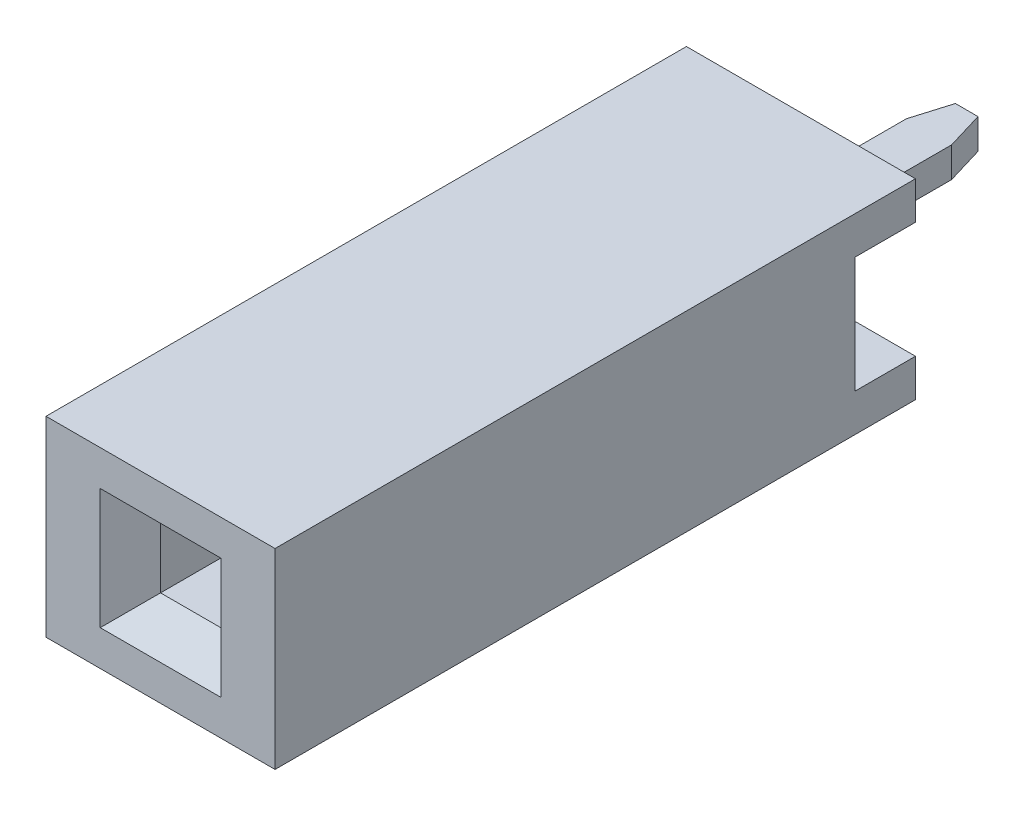
ISO-10303-21;
HEADER;
FILE_DESCRIPTION(('STEP AP214'),'2;1');
FILE_NAME('part.step','',(''),(''),'','','');
FILE_SCHEMA(('AUTOMOTIVE_DESIGN { 1 0 10303 214 1 1 1 1 }'));
ENDSEC;
DATA;
#1=APPLICATION_CONTEXT('core data for automotive mechanical design processes');
#2=APPLICATION_PROTOCOL_DEFINITION('international standard','automotive_design',2000,#1);
#3=PRODUCT_CONTEXT('',#1,'mechanical');
#4=PRODUCT('Part','Part','',(#3));
#5=PRODUCT_RELATED_PRODUCT_CATEGORY('part','',(#4));
#6=PRODUCT_DEFINITION_FORMATION('','',#4);
#7=PRODUCT_DEFINITION_CONTEXT('part definition',#1,'design');
#8=PRODUCT_DEFINITION('design','',#6,#7);
#9=PRODUCT_DEFINITION_SHAPE('','',#8);
#10=(LENGTH_UNIT() NAMED_UNIT(*) SI_UNIT(.MILLI.,.METRE.));
#11=(NAMED_UNIT(*) PLANE_ANGLE_UNIT() SI_UNIT($,.RADIAN.));
#12=(NAMED_UNIT(*) SI_UNIT($,.STERADIAN.) SOLID_ANGLE_UNIT());
#13=UNCERTAINTY_MEASURE_WITH_UNIT(LENGTH_MEASURE(1.E-05),#10,'distance_accuracy_value','');
#14=(GEOMETRIC_REPRESENTATION_CONTEXT(3) GLOBAL_UNCERTAINTY_ASSIGNED_CONTEXT((#13)) GLOBAL_UNIT_ASSIGNED_CONTEXT((#10,
#11,#12)) REPRESENTATION_CONTEXT('',''));
#15=CARTESIAN_POINT('',(0.,0.,0.));
#16=DIRECTION('',(0.,0.,1.));
#17=DIRECTION('',(1.,0.,0.));
#18=AXIS2_PLACEMENT_3D('',#15,#16,#17);
#19=CARTESIAN_POINT('',(-1.52,-0.770000000000001,1.5));
#20=DIRECTION('',(0.,0.,1.));
#21=DIRECTION('',(1.,0.,0.));
#22=AXIS2_PLACEMENT_3D('',#19,#20,#21);
#23=PLANE('',#22);
#24=DIRECTION('',(0.,-1.,0.));
#25=VECTOR('',#24,1.);
#26=CARTESIAN_POINT('',(0.4,-0.400000000000001,1.5));
#27=LINE('',#26,#25);
#28=CARTESIAN_POINT('',(0.4,-0.2,1.5));
#29=VERTEX_POINT('',#28);
#30=CARTESIAN_POINT('',(0.4,-0.400000000000001,1.5));
#31=VERTEX_POINT('',#30);
#32=EDGE_CURVE('E251',#29,#31,#27,.T.);
#33=ORIENTED_EDGE('',*,*,#32,.F.);
#34=DIRECTION('',(-1.,0.,0.));
#35=VECTOR('',#34,1.);
#36=CARTESIAN_POINT('',(0.4,-0.2,1.5));
#37=LINE('',#36,#35);
#38=CARTESIAN_POINT('',(-0.4,-0.2,1.5));
#39=VERTEX_POINT('',#38);
#40=EDGE_CURVE('E387',#29,#39,#37,.T.);
#41=ORIENTED_EDGE('',*,*,#40,.T.);
#42=DIRECTION('',(0.,1.,0.));
#43=VECTOR('',#42,1.);
#44=CARTESIAN_POINT('',(-0.4,-0.400000000000001,1.5));
#45=LINE('',#44,#43);
#46=CARTESIAN_POINT('',(-0.4,-0.400000000000001,1.5));
#47=VERTEX_POINT('',#46);
#48=EDGE_CURVE('E259',#47,#39,#45,.T.);
#49=ORIENTED_EDGE('',*,*,#48,.F.);
#50=DIRECTION('',(-1.,0.,0.));
#51=VECTOR('',#50,1.);
#52=CARTESIAN_POINT('',(0.4,-0.400000000000001,1.5));
#53=LINE('',#52,#51);
#54=EDGE_CURVE('E262',#31,#47,#53,.T.);
#55=ORIENTED_EDGE('',*,*,#54,.F.);
#56=EDGE_LOOP('',(#33,#41,#49,#55));
#57=FACE_BOUND('',#56,.T.);
#58=ADVANCED_FACE('F37',(#57),#23,.T.);
#59=CARTESIAN_POINT('',(-1.52,-0.770000000000001,0.8));
#60=DIRECTION('',(0.,0.,1.));
#61=DIRECTION('',(1.,0.,0.));
#62=AXIS2_PLACEMENT_3D('',#59,#60,#61);
#63=PLANE('',#62);
#64=DIRECTION('',(0.,-1.,0.));
#65=VECTOR('',#64,1.);
#66=CARTESIAN_POINT('',(1.52,-0.770000000000001,0.8));
#67=LINE('',#66,#65);
#68=CARTESIAN_POINT('',(1.52,0.77,0.8));
#69=VERTEX_POINT('',#68);
#70=CARTESIAN_POINT('',(1.52,-0.770000000000001,0.8));
#71=VERTEX_POINT('',#70);
#72=EDGE_CURVE('E287',#69,#71,#67,.T.);
#73=ORIENTED_EDGE('',*,*,#72,.T.);
#74=DIRECTION('',(1.,0.,0.));
#75=VECTOR('',#74,1.);
#76=CARTESIAN_POINT('',(-1.52,-0.770000000000001,0.8));
#77=LINE('',#76,#75);
#78=CARTESIAN_POINT('',(-1.52,-0.770000000000001,0.8));
#79=VERTEX_POINT('',#78);
#80=EDGE_CURVE('E295',#79,#71,#77,.T.);
#81=ORIENTED_EDGE('',*,*,#80,.F.);
#82=DIRECTION('',(0.,-1.,0.));
#83=VECTOR('',#82,1.);
#84=CARTESIAN_POINT('',(-1.52,-0.770000000000001,0.8));
#85=LINE('',#84,#83);
#86=CARTESIAN_POINT('',(-1.52,0.77,0.8));
#87=VERTEX_POINT('',#86);
#88=EDGE_CURVE('E277',#87,#79,#85,.T.);
#89=ORIENTED_EDGE('',*,*,#88,.F.);
#90=DIRECTION('',(1.,0.,0.));
#91=VECTOR('',#90,1.);
#92=CARTESIAN_POINT('',(-1.52,0.77,0.8));
#93=LINE('',#92,#91);
#94=EDGE_CURVE('E297',#87,#69,#93,.T.);
#95=ORIENTED_EDGE('',*,*,#94,.T.);
#96=EDGE_LOOP('',(#73,#81,#89,#95));
#97=FACE_BOUND('',#96,.T.);
#98=DIRECTION('',(1.,0.,0.));
#99=VECTOR('',#98,1.);
#100=CARTESIAN_POINT('',(0.3,0.2,0.8));
#101=LINE('',#100,#99);
#102=CARTESIAN_POINT('',(-0.3,0.2,0.8));
#103=VERTEX_POINT('',#102);
#104=CARTESIAN_POINT('',(0.3,0.2,0.8));
#105=VERTEX_POINT('',#104);
#106=EDGE_CURVE('E730',#103,#105,#101,.T.);
#107=ORIENTED_EDGE('',*,*,#106,.F.);
#108=DIRECTION('',(0.,-1.,0.));
#109=VECTOR('',#108,1.);
#110=CARTESIAN_POINT('',(-0.3,0.2,0.8));
#111=LINE('',#110,#109);
#112=CARTESIAN_POINT('',(-0.3,-0.2,0.8));
#113=VERTEX_POINT('',#112);
#114=EDGE_CURVE('E256',#103,#113,#111,.T.);
#115=ORIENTED_EDGE('',*,*,#114,.T.);
#116=DIRECTION('',(1.,0.,0.));
#117=VECTOR('',#116,1.);
#118=CARTESIAN_POINT('',(0.3,-0.2,0.8));
#119=LINE('',#118,#117);
#120=CARTESIAN_POINT('',(0.300000000000001,-0.2,0.8));
#121=VERTEX_POINT('',#120);
#122=EDGE_CURVE('E749',#113,#121,#119,.T.);
#123=ORIENTED_EDGE('',*,*,#122,.T.);
#124=DIRECTION('',(0.,-1.,0.));
#125=VECTOR('',#124,1.);
#126=CARTESIAN_POINT('',(0.3,0.2,0.8));
#127=LINE('',#126,#125);
#128=EDGE_CURVE('E62',#105,#121,#127,.T.);
#129=ORIENTED_EDGE('',*,*,#128,.F.);
#130=EDGE_LOOP('',(#107,#115,#123,#129));
#131=FACE_BOUND('',#130,.T.);
#132=ADVANCED_FACE('F405',(#97,#131),#63,.F.);
#133=CARTESIAN_POINT('',(1.52,1.27,0.));
#134=DIRECTION('',(0.,0.,1.));
#135=DIRECTION('',(1.,0.,0.));
#136=AXIS2_PLACEMENT_3D('',#133,#134,#135);
#137=PLANE('',#136);
#138=DIRECTION('',(0.,1.,0.));
#139=VECTOR('',#138,1.);
#140=CARTESIAN_POINT('',(-1.52,1.27,0.));
#141=LINE('',#140,#139);
#142=CARTESIAN_POINT('',(-1.52,-1.27,0.));
#143=VERTEX_POINT('',#142);
#144=CARTESIAN_POINT('',(-1.52,-0.770000000000001,0.));
#145=VERTEX_POINT('',#144);
#146=EDGE_CURVE('E316',#143,#145,#141,.T.);
#147=ORIENTED_EDGE('',*,*,#146,.T.);
#148=DIRECTION('',(1.,0.,0.));
#149=VECTOR('',#148,1.);
#150=CARTESIAN_POINT('',(-1.52,-0.770000000000001,0.));
#151=LINE('',#150,#149);
#152=CARTESIAN_POINT('',(1.52,-0.770000000000001,0.));
#153=VERTEX_POINT('',#152);
#154=EDGE_CURVE('E291',#145,#153,#151,.T.);
#155=ORIENTED_EDGE('',*,*,#154,.T.);
#156=DIRECTION('',(0.,1.,0.));
#157=VECTOR('',#156,1.);
#158=CARTESIAN_POINT('',(1.52,1.27,0.));
#159=LINE('',#158,#157);
#160=CARTESIAN_POINT('',(1.52,-1.27,0.));
#161=VERTEX_POINT('',#160);
#162=EDGE_CURVE('E305',#161,#153,#159,.T.);
#163=ORIENTED_EDGE('',*,*,#162,.F.);
#164=DIRECTION('',(-1.,0.,0.));
#165=VECTOR('',#164,1.);
#166=CARTESIAN_POINT('',(1.52,-1.27,0.));
#167=LINE('',#166,#165);
#168=EDGE_CURVE('E330',#161,#143,#167,.T.);
#169=ORIENTED_EDGE('',*,*,#168,.T.);
#170=EDGE_LOOP('',(#147,#155,#163,#169));
#171=FACE_BOUND('',#170,.T.);
#172=ADVANCED_FACE('F409',(#171),#137,.F.);
#173=CARTESIAN_POINT('',(1.52,-1.27,0.));
#174=DIRECTION('',(0.,1.,0.));
#175=DIRECTION('',(0.,0.,1.));
#176=AXIS2_PLACEMENT_3D('',#173,#174,#175);
#177=PLANE('',#176);
#178=DIRECTION('',(0.,0.,-1.));
#179=VECTOR('',#178,1.);
#180=CARTESIAN_POINT('',(-1.52,-1.27,0.));
#181=LINE('',#180,#179);
#182=CARTESIAN_POINT('',(-1.52,-1.27,8.5));
#183=VERTEX_POINT('',#182);
#184=EDGE_CURVE('E294',#183,#143,#181,.T.);
#185=ORIENTED_EDGE('',*,*,#184,.T.);
#186=ORIENTED_EDGE('',*,*,#168,.F.);
#187=DIRECTION('',(0.,0.,-1.));
#188=VECTOR('',#187,1.);
#189=CARTESIAN_POINT('',(1.52,-1.27,0.));
#190=LINE('',#189,#188);
#191=CARTESIAN_POINT('',(1.52,-1.27,8.5));
#192=VERTEX_POINT('',#191);
#193=EDGE_CURVE('E300',#192,#161,#190,.T.);
#194=ORIENTED_EDGE('',*,*,#193,.F.);
#195=DIRECTION('',(-1.,0.,0.));
#196=VECTOR('',#195,1.);
#197=CARTESIAN_POINT('',(1.52,-1.27,8.5));
#198=LINE('',#197,#196);
#199=EDGE_CURVE('E312',#192,#183,#198,.T.);
#200=ORIENTED_EDGE('',*,*,#199,.T.);
#201=EDGE_LOOP('',(#185,#186,#194,#200));
#202=FACE_BOUND('',#201,.T.);
#203=ADVANCED_FACE('F446',(#202),#177,.F.);
#204=CARTESIAN_POINT('',(1.52,0.77,0.));
#205=VERTEX_POINT('',#204);
#206=CARTESIAN_POINT('',(1.52,1.27,0.));
#207=VERTEX_POINT('',#206);
#208=EDGE_CURVE('E303',#205,#207,#159,.T.);
#209=ORIENTED_EDGE('',*,*,#208,.F.);
#210=DIRECTION('',(1.,0.,0.));
#211=VECTOR('',#210,1.);
#212=CARTESIAN_POINT('',(-1.52,0.77,0.));
#213=LINE('',#212,#211);
#214=CARTESIAN_POINT('',(-1.52,0.77,0.));
#215=VERTEX_POINT('',#214);
#216=EDGE_CURVE('E284',#215,#205,#213,.T.);
#217=ORIENTED_EDGE('',*,*,#216,.F.);
#218=CARTESIAN_POINT('',(-1.52,1.27,0.));
#219=VERTEX_POINT('',#218);
#220=EDGE_CURVE('E315',#215,#219,#141,.T.);
#221=ORIENTED_EDGE('',*,*,#220,.T.);
#222=DIRECTION('',(-1.,0.,0.));
#223=VECTOR('',#222,1.);
#224=CARTESIAN_POINT('',(1.52,1.27,0.));
#225=LINE('',#224,#223);
#226=EDGE_CURVE('E327',#207,#219,#225,.T.);
#227=ORIENTED_EDGE('',*,*,#226,.F.);
#228=EDGE_LOOP('',(#209,#217,#221,#227));
#229=FACE_BOUND('',#228,.T.);
#230=ADVANCED_FACE('F442',(#229),#137,.F.);
#231=CARTESIAN_POINT('',(1.52,1.27,0.));
#232=DIRECTION('',(0.,-1.,0.));
#233=DIRECTION('',(0.,0.,-1.));
#234=AXIS2_PLACEMENT_3D('',#231,#232,#233);
#235=PLANE('',#234);
#236=DIRECTION('',(0.,0.,1.));
#237=VECTOR('',#236,1.);
#238=CARTESIAN_POINT('',(-1.52,1.27,0.));
#239=LINE('',#238,#237);
#240=CARTESIAN_POINT('',(-1.52,1.27,8.5));
#241=VERTEX_POINT('',#240);
#242=EDGE_CURVE('E319',#219,#241,#239,.T.);
#243=ORIENTED_EDGE('',*,*,#242,.T.);
#244=DIRECTION('',(-1.,0.,0.));
#245=VECTOR('',#244,1.);
#246=CARTESIAN_POINT('',(1.52,1.27,8.5));
#247=LINE('',#246,#245);
#248=CARTESIAN_POINT('',(1.52,1.27,8.5));
#249=VERTEX_POINT('',#248);
#250=EDGE_CURVE('E324',#249,#241,#247,.T.);
#251=ORIENTED_EDGE('',*,*,#250,.F.);
#252=DIRECTION('',(0.,0.,1.));
#253=VECTOR('',#252,1.);
#254=CARTESIAN_POINT('',(1.52,1.27,0.));
#255=LINE('',#254,#253);
#256=EDGE_CURVE('E308',#207,#249,#255,.T.);
#257=ORIENTED_EDGE('',*,*,#256,.F.);
#258=ORIENTED_EDGE('',*,*,#226,.T.);
#259=EDGE_LOOP('',(#243,#251,#257,#258));
#260=FACE_BOUND('',#259,.T.);
#261=ADVANCED_FACE('F439',(#260),#235,.F.);
#262=CARTESIAN_POINT('',(1.52,1.27,8.5));
#263=DIRECTION('',(0.,0.,-1.));
#264=DIRECTION('',(-1.,0.,0.));
#265=AXIS2_PLACEMENT_3D('',#262,#263,#264);
#266=PLANE('',#265);
#267=DIRECTION('',(0.,-1.,0.));
#268=VECTOR('',#267,1.);
#269=CARTESIAN_POINT('',(0.800000000000002,1.27,8.5));
#270=LINE('',#269,#268);
#271=CARTESIAN_POINT('',(0.800000000000002,0.800000000000001,8.5));
#272=VERTEX_POINT('',#271);
#273=CARTESIAN_POINT('',(0.800000000000002,-0.800000000000003,8.5));
#274=VERTEX_POINT('',#273);
#275=EDGE_CURVE('E340',#272,#274,#270,.T.);
#276=ORIENTED_EDGE('',*,*,#275,.T.);
#277=DIRECTION('',(-1.,0.,0.));
#278=VECTOR('',#277,1.);
#279=CARTESIAN_POINT('',(1.52,-0.800000000000003,8.5));
#280=LINE('',#279,#278);
#281=CARTESIAN_POINT('',(-0.800000000000002,-0.800000000000003,8.5));
#282=VERTEX_POINT('',#281);
#283=EDGE_CURVE('E342',#274,#282,#280,.T.);
#284=ORIENTED_EDGE('',*,*,#283,.T.);
#285=DIRECTION('',(0.,1.,0.));
#286=VECTOR('',#285,1.);
#287=CARTESIAN_POINT('',(-0.800000000000002,1.27,8.5));
#288=LINE('',#287,#286);
#289=CARTESIAN_POINT('',(-0.800000000000002,0.800000000000001,8.5));
#290=VERTEX_POINT('',#289);
#291=EDGE_CURVE('E336',#282,#290,#288,.T.);
#292=ORIENTED_EDGE('',*,*,#291,.T.);
#293=DIRECTION('',(1.,0.,0.));
#294=VECTOR('',#293,1.);
#295=CARTESIAN_POINT('',(1.52,0.800000000000001,8.5));
#296=LINE('',#295,#294);
#297=EDGE_CURVE('E338',#290,#272,#296,.T.);
#298=ORIENTED_EDGE('',*,*,#297,.T.);
#299=EDGE_LOOP('',(#276,#284,#292,#298));
#300=FACE_BOUND('',#299,.T.);
#301=DIRECTION('',(0.,-1.,0.));
#302=VECTOR('',#301,1.);
#303=CARTESIAN_POINT('',(-1.52,1.27,8.5));
#304=LINE('',#303,#302);
#305=EDGE_CURVE('E304',#241,#183,#304,.T.);
#306=ORIENTED_EDGE('',*,*,#305,.T.);
#307=ORIENTED_EDGE('',*,*,#199,.F.);
#308=DIRECTION('',(0.,-1.,0.));
#309=VECTOR('',#308,1.);
#310=CARTESIAN_POINT('',(1.52,1.27,8.5));
#311=LINE('',#310,#309);
#312=EDGE_CURVE('E310',#249,#192,#311,.T.);
#313=ORIENTED_EDGE('',*,*,#312,.F.);
#314=ORIENTED_EDGE('',*,*,#250,.T.);
#315=EDGE_LOOP('',(#306,#307,#313,#314));
#316=FACE_BOUND('',#315,.T.);
#317=ADVANCED_FACE('F368',(#300,#316),#266,.F.);
#318=CARTESIAN_POINT('',(1.52,0.,0.));
#319=DIRECTION('',(1.,0.,0.));
#320=DIRECTION('',(0.,0.,-1.));
#321=AXIS2_PLACEMENT_3D('',#318,#319,#320);
#322=PLANE('',#321);
#323=DIRECTION('',(0.,0.,-1.));
#324=VECTOR('',#323,1.);
#325=CARTESIAN_POINT('',(1.52,-0.770000000000001,0.));
#326=LINE('',#325,#324);
#327=EDGE_CURVE('E278',#71,#153,#326,.T.);
#328=ORIENTED_EDGE('',*,*,#327,.F.);
#329=ORIENTED_EDGE('',*,*,#72,.F.);
#330=DIRECTION('',(0.,0.,1.));
#331=VECTOR('',#330,1.);
#332=CARTESIAN_POINT('',(1.52,0.77,0.8));
#333=LINE('',#332,#331);
#334=EDGE_CURVE('E273',#205,#69,#333,.T.);
#335=ORIENTED_EDGE('',*,*,#334,.F.);
#336=ORIENTED_EDGE('',*,*,#208,.T.);
#337=ORIENTED_EDGE('',*,*,#256,.T.);
#338=ORIENTED_EDGE('',*,*,#312,.T.);
#339=ORIENTED_EDGE('',*,*,#193,.T.);
#340=ORIENTED_EDGE('',*,*,#162,.T.);
#341=EDGE_LOOP('',(#328,#329,#335,#336,#337,#338,#339,#340));
#342=FACE_BOUND('',#341,.T.);
#343=ADVANCED_FACE('F430',(#342),#322,.T.);
#344=CARTESIAN_POINT('',(-1.52,0.,0.));
#345=DIRECTION('',(1.,0.,0.));
#346=DIRECTION('',(0.,0.,-1.));
#347=AXIS2_PLACEMENT_3D('',#344,#345,#346);
#348=PLANE('',#347);
#349=ORIENTED_EDGE('',*,*,#88,.T.);
#350=DIRECTION('',(0.,0.,-1.));
#351=VECTOR('',#350,1.);
#352=CARTESIAN_POINT('',(-1.52,-0.770000000000001,0.));
#353=LINE('',#352,#351);
#354=EDGE_CURVE('E281',#79,#145,#353,.T.);
#355=ORIENTED_EDGE('',*,*,#354,.T.);
#356=ORIENTED_EDGE('',*,*,#146,.F.);
#357=ORIENTED_EDGE('',*,*,#184,.F.);
#358=ORIENTED_EDGE('',*,*,#305,.F.);
#359=ORIENTED_EDGE('',*,*,#242,.F.);
#360=ORIENTED_EDGE('',*,*,#220,.F.);
#361=DIRECTION('',(0.,0.,1.));
#362=VECTOR('',#361,1.);
#363=CARTESIAN_POINT('',(-1.52,0.77,0.8));
#364=LINE('',#363,#362);
#365=EDGE_CURVE('E274',#215,#87,#364,.T.);
#366=ORIENTED_EDGE('',*,*,#365,.T.);
#367=EDGE_LOOP('',(#349,#355,#356,#357,#358,#359,#360,#366));
#368=FACE_BOUND('',#367,.T.);
#369=ADVANCED_FACE('F424',(#368),#348,.F.);
#370=CARTESIAN_POINT('',(-1.52,-0.770000000000001,0.));
#371=DIRECTION('',(0.,-1.,0.));
#372=DIRECTION('',(0.,0.,-1.));
#373=AXIS2_PLACEMENT_3D('',#370,#371,#372);
#374=PLANE('',#373);
#375=ORIENTED_EDGE('',*,*,#327,.T.);
#376=ORIENTED_EDGE('',*,*,#154,.F.);
#377=ORIENTED_EDGE('',*,*,#354,.F.);
#378=ORIENTED_EDGE('',*,*,#80,.T.);
#379=EDGE_LOOP('',(#375,#376,#377,#378));
#380=FACE_BOUND('',#379,.T.);
#381=ADVANCED_FACE('F422',(#380),#374,.F.);
#382=CARTESIAN_POINT('',(-1.52,0.77,0.8));
#383=DIRECTION('',(0.,1.,0.));
#384=DIRECTION('',(0.,0.,1.));
#385=AXIS2_PLACEMENT_3D('',#382,#383,#384);
#386=PLANE('',#385);
#387=ORIENTED_EDGE('',*,*,#334,.T.);
#388=ORIENTED_EDGE('',*,*,#94,.F.);
#389=ORIENTED_EDGE('',*,*,#365,.F.);
#390=ORIENTED_EDGE('',*,*,#216,.T.);
#391=EDGE_LOOP('',(#387,#388,#389,#390));
#392=FACE_BOUND('',#391,.T.);
#393=ADVANCED_FACE('F401',(#392),#386,.F.);
#394=CARTESIAN_POINT('',(-0.4,-0.400000000000001,-0.331370849898475));
#395=DIRECTION('',(-1.,0.,0.));
#396=DIRECTION('',(0.,-1.,0.));
#397=AXIS2_PLACEMENT_3D('',#394,#395,#396);
#398=PLANE('',#397);
#399=DIRECTION('',(0.,-1.,0.));
#400=VECTOR('',#399,1.);
#401=CARTESIAN_POINT('',(-0.399999999999999,0.2,6.9));
#402=LINE('',#401,#400);
#403=CARTESIAN_POINT('',(-0.399999999999999,0.2,6.9));
#404=VERTEX_POINT('',#403);
#405=CARTESIAN_POINT('',(-0.399999999999999,-0.2,6.9));
#406=VERTEX_POINT('',#405);
#407=EDGE_CURVE('E752',#404,#406,#402,.T.);
#408=ORIENTED_EDGE('',*,*,#407,.F.);
#409=DIRECTION('',(0.,0.,1.));
#410=VECTOR('',#409,1.);
#411=CARTESIAN_POINT('',(-0.4,0.2,1.5));
#412=LINE('',#411,#410);
#413=CARTESIAN_POINT('',(-0.4,0.2,1.5));
#414=VERTEX_POINT('',#413);
#415=EDGE_CURVE('E245',#414,#404,#412,.T.);
#416=ORIENTED_EDGE('',*,*,#415,.F.);
#417=CARTESIAN_POINT('',(-0.4,0.399999999999999,1.5));
#418=VERTEX_POINT('',#417);
#419=EDGE_CURVE('E244',#414,#418,#45,.T.);
#420=ORIENTED_EDGE('',*,*,#419,.T.);
#421=DIRECTION('',(0.,0.,1.));
#422=VECTOR('',#421,1.);
#423=CARTESIAN_POINT('',(-0.4,0.399999999999999,-0.331370849898475));
#424=LINE('',#423,#422);
#425=CARTESIAN_POINT('',(-0.4,0.399999999999999,8.1));
#426=VERTEX_POINT('',#425);
#427=EDGE_CURVE('E254',#418,#426,#424,.T.);
#428=ORIENTED_EDGE('',*,*,#427,.T.);
#429=DIRECTION('',(0.,-1.,0.));
#430=VECTOR('',#429,1.);
#431=CARTESIAN_POINT('',(-0.4,-0.400000000000001,8.1));
#432=LINE('',#431,#430);
#433=CARTESIAN_POINT('',(-0.4,-0.400000000000001,8.1));
#434=VERTEX_POINT('',#433);
#435=EDGE_CURVE('E12',#426,#434,#432,.T.);
#436=ORIENTED_EDGE('',*,*,#435,.T.);
#437=DIRECTION('',(0.,0.,1.));
#438=VECTOR('',#437,1.);
#439=CARTESIAN_POINT('',(-0.4,-0.400000000000001,-0.331370849898475));
#440=LINE('',#439,#438);
#441=EDGE_CURVE('E269',#47,#434,#440,.T.);
#442=ORIENTED_EDGE('',*,*,#441,.F.);
#443=ORIENTED_EDGE('',*,*,#48,.T.);
#444=DIRECTION('',(0.,0.,1.));
#445=VECTOR('',#444,1.);
#446=CARTESIAN_POINT('',(-0.4,-0.2,1.5));
#447=LINE('',#446,#445);
#448=EDGE_CURVE('E54',#39,#406,#447,.T.);
#449=ORIENTED_EDGE('',*,*,#448,.T.);
#450=EDGE_LOOP('',(#408,#416,#420,#428,#436,#442,#443,#449));
#451=FACE_BOUND('',#450,.T.);
#452=ADVANCED_FACE('F390',(#451),#398,.F.);
#453=CARTESIAN_POINT('',(0.4,0.399999999999999,-0.331370849898475));
#454=DIRECTION('',(0.,1.,0.));
#455=DIRECTION('',(0.,0.,1.));
#456=AXIS2_PLACEMENT_3D('',#453,#454,#455);
#457=PLANE('',#456);
#458=DIRECTION('',(0.,0.,1.));
#459=VECTOR('',#458,1.);
#460=CARTESIAN_POINT('',(0.4,0.399999999999999,-0.331370849898475));
#461=LINE('',#460,#459);
#462=CARTESIAN_POINT('',(0.4,0.399999999999999,1.5));
#463=VERTEX_POINT('',#462);
#464=CARTESIAN_POINT('',(0.4,0.399999999999999,8.1));
#465=VERTEX_POINT('',#464);
#466=EDGE_CURVE('E249',#463,#465,#461,.T.);
#467=ORIENTED_EDGE('',*,*,#466,.T.);
#468=DIRECTION('',(-1.,0.,0.));
#469=VECTOR('',#468,1.);
#470=CARTESIAN_POINT('',(0.4,0.399999999999999,8.1));
#471=LINE('',#470,#469);
#472=EDGE_CURVE('E46',#465,#426,#471,.T.);
#473=ORIENTED_EDGE('',*,*,#472,.T.);
#474=ORIENTED_EDGE('',*,*,#427,.F.);
#475=DIRECTION('',(1.,0.,0.));
#476=VECTOR('',#475,1.);
#477=CARTESIAN_POINT('',(0.4,0.399999999999999,1.5));
#478=LINE('',#477,#476);
#479=EDGE_CURVE('E250',#418,#463,#478,.T.);
#480=ORIENTED_EDGE('',*,*,#479,.T.);
#481=EDGE_LOOP('',(#467,#473,#474,#480));
#482=FACE_BOUND('',#481,.T.);
#483=ADVANCED_FACE('F393',(#482),#457,.F.);
#484=CARTESIAN_POINT('',(0.4,-0.400000000000001,-0.331370849898475));
#485=DIRECTION('',(1.,0.,0.));
#486=DIRECTION('',(0.,1.,0.));
#487=AXIS2_PLACEMENT_3D('',#484,#485,#486);
#488=PLANE('',#487);
#489=CARTESIAN_POINT('',(0.4,0.2,1.5));
#490=VERTEX_POINT('',#489);
#491=EDGE_CURVE('E242',#463,#490,#27,.T.);
#492=ORIENTED_EDGE('',*,*,#491,.T.);
#493=DIRECTION('',(0.,0.,-1.));
#494=VECTOR('',#493,1.);
#495=CARTESIAN_POINT('',(0.4,0.2,6.9));
#496=LINE('',#495,#494);
#497=CARTESIAN_POINT('',(0.4,0.2,6.9));
#498=VERTEX_POINT('',#497);
#499=EDGE_CURVE('E224',#498,#490,#496,.T.);
#500=ORIENTED_EDGE('',*,*,#499,.F.);
#501=DIRECTION('',(0.,-1.,0.));
#502=VECTOR('',#501,1.);
#503=CARTESIAN_POINT('',(0.4,0.2,6.9));
#504=LINE('',#503,#502);
#505=CARTESIAN_POINT('',(0.4,-0.2,6.9));
#506=VERTEX_POINT('',#505);
#507=EDGE_CURVE('E797',#498,#506,#504,.T.);
#508=ORIENTED_EDGE('',*,*,#507,.T.);
#509=DIRECTION('',(0.,0.,-1.));
#510=VECTOR('',#509,1.);
#511=CARTESIAN_POINT('',(0.4,-0.2,6.9));
#512=LINE('',#511,#510);
#513=EDGE_CURVE('E384',#506,#29,#512,.T.);
#514=ORIENTED_EDGE('',*,*,#513,.T.);
#515=ORIENTED_EDGE('',*,*,#32,.T.);
#516=DIRECTION('',(0.,0.,1.));
#517=VECTOR('',#516,1.);
#518=CARTESIAN_POINT('',(0.4,-0.400000000000001,-0.331370849898475));
#519=LINE('',#518,#517);
#520=CARTESIAN_POINT('',(0.4,-0.400000000000001,8.1));
#521=VERTEX_POINT('',#520);
#522=EDGE_CURVE('E266',#31,#521,#519,.T.);
#523=ORIENTED_EDGE('',*,*,#522,.T.);
#524=DIRECTION('',(0.,1.,0.));
#525=VECTOR('',#524,1.);
#526=CARTESIAN_POINT('',(0.4,-0.400000000000001,8.1));
#527=LINE('',#526,#525);
#528=EDGE_CURVE('E345',#521,#465,#527,.T.);
#529=ORIENTED_EDGE('',*,*,#528,.T.);
#530=ORIENTED_EDGE('',*,*,#466,.F.);
#531=EDGE_LOOP('',(#492,#500,#508,#514,#515,#523,#529,#530));
#532=FACE_BOUND('',#531,.T.);
#533=ADVANCED_FACE('F247',(#532),#488,.F.);
#534=CARTESIAN_POINT('',(0.4,-0.400000000000001,-0.331370849898475));
#535=DIRECTION('',(0.,-1.,0.));
#536=DIRECTION('',(0.,0.,-1.));
#537=AXIS2_PLACEMENT_3D('',#534,#535,#536);
#538=PLANE('',#537);
#539=ORIENTED_EDGE('',*,*,#441,.T.);
#540=DIRECTION('',(1.,0.,0.));
#541=VECTOR('',#540,1.);
#542=CARTESIAN_POINT('',(0.4,-0.400000000000001,8.1));
#543=LINE('',#542,#541);
#544=EDGE_CURVE('E333',#434,#521,#543,.T.);
#545=ORIENTED_EDGE('',*,*,#544,.T.);
#546=ORIENTED_EDGE('',*,*,#522,.F.);
#547=ORIENTED_EDGE('',*,*,#54,.T.);
#548=EDGE_LOOP('',(#539,#545,#546,#547));
#549=FACE_BOUND('',#548,.T.);
#550=ADVANCED_FACE('F378',(#549),#538,.F.);
#551=DIRECTION('',(-1.,0.,0.));
#552=VECTOR('',#551,1.);
#553=CARTESIAN_POINT('',(0.4,0.2,1.5));
#554=LINE('',#553,#552);
#555=EDGE_CURVE('E227',#490,#414,#554,.T.);
#556=ORIENTED_EDGE('',*,*,#555,.F.);
#557=ORIENTED_EDGE('',*,*,#491,.F.);
#558=ORIENTED_EDGE('',*,*,#479,.F.);
#559=ORIENTED_EDGE('',*,*,#419,.F.);
#560=EDGE_LOOP('',(#556,#557,#558,#559));
#561=FACE_BOUND('',#560,.T.);
#562=ADVANCED_FACE('F240',(#561),#23,.T.);
#563=CARTESIAN_POINT('',(0.4,0.399999999999999,8.1));
#564=DIRECTION('',(0.,0.707106781186547,-0.707106781186548));
#565=DIRECTION('',(-1.,0.,0.));
#566=AXIS2_PLACEMENT_3D('',#563,#564,#565);
#567=PLANE('',#566);
#568=DIRECTION('',(0.577350269189626,0.577350269189626,0.577350269189625));
#569=VECTOR('',#568,1.);
#570=CARTESIAN_POINT('',(0.133333333333333,0.133333333333332,7.83333333333333));
#571=LINE('',#570,#569);
#572=EDGE_CURVE('E351',#272,#465,#571,.F.);
#573=ORIENTED_EDGE('',*,*,#572,.F.);
#574=ORIENTED_EDGE('',*,*,#297,.F.);
#575=DIRECTION('',(-0.577350269189626,0.577350269189626,0.577350269189625));
#576=VECTOR('',#575,1.);
#577=CARTESIAN_POINT('',(-0.133333333333333,0.133333333333332,7.83333333333333));
#578=LINE('',#577,#576);
#579=EDGE_CURVE('E41',#426,#290,#578,.T.);
#580=ORIENTED_EDGE('',*,*,#579,.F.);
#581=ORIENTED_EDGE('',*,*,#472,.F.);
#582=EDGE_LOOP('',(#573,#574,#580,#581));
#583=FACE_BOUND('',#582,.T.);
#584=ADVANCED_FACE('F39',(#583),#567,.F.);
#585=CARTESIAN_POINT('',(-0.4,-0.400000000000001,8.1));
#586=DIRECTION('',(-0.707106781186547,0.,-0.707106781186548));
#587=DIRECTION('',(0.,-1.,0.));
#588=AXIS2_PLACEMENT_3D('',#585,#586,#587);
#589=PLANE('',#588);
#590=ORIENTED_EDGE('',*,*,#579,.T.);
#591=ORIENTED_EDGE('',*,*,#291,.F.);
#592=DIRECTION('',(0.577350269189626,0.577350269189626,-0.577350269189625));
#593=VECTOR('',#592,1.);
#594=CARTESIAN_POINT('',(-0.133333333333333,-0.133333333333334,7.83333333333333));
#595=LINE('',#594,#593);
#596=EDGE_CURVE('E350',#434,#282,#595,.F.);
#597=ORIENTED_EDGE('',*,*,#596,.F.);
#598=ORIENTED_EDGE('',*,*,#435,.F.);
#599=EDGE_LOOP('',(#590,#591,#597,#598));
#600=FACE_BOUND('',#599,.T.);
#601=ADVANCED_FACE('F362',(#600),#589,.F.);
#602=CARTESIAN_POINT('',(0.4,-0.400000000000001,8.1));
#603=DIRECTION('',(0.707106781186547,0.,-0.707106781186548));
#604=DIRECTION('',(0.,1.,0.));
#605=AXIS2_PLACEMENT_3D('',#602,#603,#604);
#606=PLANE('',#605);
#607=ORIENTED_EDGE('',*,*,#572,.T.);
#608=ORIENTED_EDGE('',*,*,#528,.F.);
#609=DIRECTION('',(0.577350269189626,-0.577350269189626,0.577350269189625));
#610=VECTOR('',#609,1.);
#611=CARTESIAN_POINT('',(0.4,-0.400000000000001,8.1));
#612=LINE('',#611,#610);
#613=EDGE_CURVE('E348',#274,#521,#612,.F.);
#614=ORIENTED_EDGE('',*,*,#613,.F.);
#615=ORIENTED_EDGE('',*,*,#275,.F.);
#616=EDGE_LOOP('',(#607,#608,#614,#615));
#617=FACE_BOUND('',#616,.T.);
#618=ADVANCED_FACE('F375',(#617),#606,.F.);
#619=CARTESIAN_POINT('',(0.4,-0.400000000000001,8.1));
#620=DIRECTION('',(0.,-0.707106781186547,-0.707106781186548));
#621=DIRECTION('',(1.,0.,0.));
#622=AXIS2_PLACEMENT_3D('',#619,#620,#621);
#623=PLANE('',#622);
#624=ORIENTED_EDGE('',*,*,#596,.T.);
#625=ORIENTED_EDGE('',*,*,#283,.F.);
#626=ORIENTED_EDGE('',*,*,#613,.T.);
#627=ORIENTED_EDGE('',*,*,#544,.F.);
#628=EDGE_LOOP('',(#624,#625,#626,#627));
#629=FACE_BOUND('',#628,.T.);
#630=ADVANCED_FACE('F373',(#629),#623,.F.);
#631=CARTESIAN_POINT('',(0.3,0.2,0.));
#632=DIRECTION('',(-1.,0.,0.));
#633=DIRECTION('',(0.,0.,1.));
#634=AXIS2_PLACEMENT_3D('',#631,#632,#633);
#635=PLANE('',#634);
#636=DIRECTION('',(0.,0.,-1.));
#637=VECTOR('',#636,1.);
#638=CARTESIAN_POINT('',(0.3,-0.2,0.));
#639=LINE('',#638,#637);
#640=CARTESIAN_POINT('',(0.3,-0.2,-1.7));
#641=VERTEX_POINT('',#640);
#642=EDGE_CURVE('E751',#121,#641,#639,.T.);
#643=ORIENTED_EDGE('',*,*,#642,.T.);
#644=DIRECTION('',(0.,-1.,0.));
#645=VECTOR('',#644,1.);
#646=CARTESIAN_POINT('',(0.3,0.2,-1.7));
#647=LINE('',#646,#645);
#648=CARTESIAN_POINT('',(0.3,0.2,-1.7));
#649=VERTEX_POINT('',#648);
#650=EDGE_CURVE('E769',#649,#641,#647,.T.);
#651=ORIENTED_EDGE('',*,*,#650,.F.);
#652=DIRECTION('',(0.,0.,-1.));
#653=VECTOR('',#652,1.);
#654=CARTESIAN_POINT('',(0.3,0.2,0.));
#655=LINE('',#654,#653);
#656=EDGE_CURVE('E733',#105,#649,#655,.T.);
#657=ORIENTED_EDGE('',*,*,#656,.F.);
#658=ORIENTED_EDGE('',*,*,#128,.T.);
#659=EDGE_LOOP('',(#643,#651,#657,#658));
#660=FACE_BOUND('',#659,.T.);
#661=ADVANCED_FACE('F453',(#660),#635,.F.);
#662=CARTESIAN_POINT('',(0.3,0.2,-1.7));
#663=DIRECTION('',(-0.957826285221152,0.,0.287347885566345));
#664=DIRECTION('',(0.287347885566345,0.,0.957826285221152));
#665=AXIS2_PLACEMENT_3D('',#662,#663,#664);
#666=PLANE('',#665);
#667=DIRECTION('',(-0.287347885566345,0.,-0.957826285221152));
#668=VECTOR('',#667,1.);
#669=CARTESIAN_POINT('',(0.3,-0.2,-1.7));
#670=LINE('',#669,#668);
#671=CARTESIAN_POINT('',(0.15,-0.2,-2.2));
#672=VERTEX_POINT('',#671);
#673=EDGE_CURVE('E754',#641,#672,#670,.T.);
#674=ORIENTED_EDGE('',*,*,#673,.T.);
#675=DIRECTION('',(0.,-1.,0.));
#676=VECTOR('',#675,1.);
#677=CARTESIAN_POINT('',(0.15,0.2,-2.2));
#678=LINE('',#677,#676);
#679=CARTESIAN_POINT('',(0.15,0.2,-2.2));
#680=VERTEX_POINT('',#679);
#681=EDGE_CURVE('E766',#680,#672,#678,.T.);
#682=ORIENTED_EDGE('',*,*,#681,.F.);
#683=DIRECTION('',(-0.287347885566345,0.,-0.957826285221152));
#684=VECTOR('',#683,1.);
#685=CARTESIAN_POINT('',(0.3,0.2,-1.7));
#686=LINE('',#685,#684);
#687=EDGE_CURVE('E736',#649,#680,#686,.T.);
#688=ORIENTED_EDGE('',*,*,#687,.F.);
#689=ORIENTED_EDGE('',*,*,#650,.T.);
#690=EDGE_LOOP('',(#674,#682,#688,#689));
#691=FACE_BOUND('',#690,.T.);
#692=ADVANCED_FACE('F474',(#691),#666,.F.);
#693=CARTESIAN_POINT('',(-0.15,0.2,-2.2));
#694=DIRECTION('',(0.,0.,1.));
#695=DIRECTION('',(1.,0.,0.));
#696=AXIS2_PLACEMENT_3D('',#693,#694,#695);
#697=PLANE('',#696);
#698=DIRECTION('',(-1.,0.,0.));
#699=VECTOR('',#698,1.);
#700=CARTESIAN_POINT('',(-0.15,-0.2,-2.2));
#701=LINE('',#700,#699);
#702=CARTESIAN_POINT('',(-0.15,-0.2,-2.2));
#703=VERTEX_POINT('',#702);
#704=EDGE_CURVE('E756',#672,#703,#701,.T.);
#705=ORIENTED_EDGE('',*,*,#704,.T.);
#706=DIRECTION('',(0.,-1.,0.));
#707=VECTOR('',#706,1.);
#708=CARTESIAN_POINT('',(-0.15,0.2,-2.2));
#709=LINE('',#708,#707);
#710=CARTESIAN_POINT('',(-0.15,0.2,-2.2));
#711=VERTEX_POINT('',#710);
#712=EDGE_CURVE('E763',#711,#703,#709,.T.);
#713=ORIENTED_EDGE('',*,*,#712,.F.);
#714=DIRECTION('',(-1.,0.,0.));
#715=VECTOR('',#714,1.);
#716=CARTESIAN_POINT('',(-0.15,0.2,-2.2));
#717=LINE('',#716,#715);
#718=EDGE_CURVE('E743',#680,#711,#717,.T.);
#719=ORIENTED_EDGE('',*,*,#718,.F.);
#720=ORIENTED_EDGE('',*,*,#681,.T.);
#721=EDGE_LOOP('',(#705,#713,#719,#720));
#722=FACE_BOUND('',#721,.T.);
#723=ADVANCED_FACE('F480',(#722),#697,.F.);
#724=CARTESIAN_POINT('',(-0.3,0.2,-1.7));
#725=DIRECTION('',(0.957826285221152,0.,0.287347885566345));
#726=DIRECTION('',(0.287347885566345,0.,-0.957826285221152));
#727=AXIS2_PLACEMENT_3D('',#724,#725,#726);
#728=PLANE('',#727);
#729=DIRECTION('',(-0.287347885566345,0.,0.957826285221152));
#730=VECTOR('',#729,1.);
#731=CARTESIAN_POINT('',(-0.3,-0.2,-1.7));
#732=LINE('',#731,#730);
#733=CARTESIAN_POINT('',(-0.3,-0.2,-1.7));
#734=VERTEX_POINT('',#733);
#735=EDGE_CURVE('E758',#703,#734,#732,.T.);
#736=ORIENTED_EDGE('',*,*,#735,.T.);
#737=DIRECTION('',(0.,-1.,0.));
#738=VECTOR('',#737,1.);
#739=CARTESIAN_POINT('',(-0.3,0.2,-1.7));
#740=LINE('',#739,#738);
#741=CARTESIAN_POINT('',(-0.3,0.2,-1.7));
#742=VERTEX_POINT('',#741);
#743=EDGE_CURVE('E748',#742,#734,#740,.T.);
#744=ORIENTED_EDGE('',*,*,#743,.F.);
#745=DIRECTION('',(-0.287347885566345,0.,0.957826285221152));
#746=VECTOR('',#745,1.);
#747=CARTESIAN_POINT('',(-0.3,0.2,-1.7));
#748=LINE('',#747,#746);
#749=EDGE_CURVE('E745',#711,#742,#748,.T.);
#750=ORIENTED_EDGE('',*,*,#749,.F.);
#751=ORIENTED_EDGE('',*,*,#712,.T.);
#752=EDGE_LOOP('',(#736,#744,#750,#751));
#753=FACE_BOUND('',#752,.T.);
#754=ADVANCED_FACE('F488',(#753),#728,.F.);
#755=CARTESIAN_POINT('',(-0.3,0.2,0.));
#756=DIRECTION('',(1.,0.,0.));
#757=DIRECTION('',(0.,0.,-1.));
#758=AXIS2_PLACEMENT_3D('',#755,#756,#757);
#759=PLANE('',#758);
#760=DIRECTION('',(0.,0.,1.));
#761=VECTOR('',#760,1.);
#762=CARTESIAN_POINT('',(-0.3,-0.2,0.));
#763=LINE('',#762,#761);
#764=EDGE_CURVE('E738',#734,#113,#763,.T.);
#765=ORIENTED_EDGE('',*,*,#764,.T.);
#766=ORIENTED_EDGE('',*,*,#114,.F.);
#767=DIRECTION('',(0.,0.,1.));
#768=VECTOR('',#767,1.);
#769=CARTESIAN_POINT('',(-0.3,0.2,0.8));
#770=LINE('',#769,#768);
#771=EDGE_CURVE('E734',#742,#103,#770,.T.);
#772=ORIENTED_EDGE('',*,*,#771,.F.);
#773=ORIENTED_EDGE('',*,*,#743,.T.);
#774=EDGE_LOOP('',(#765,#766,#772,#773));
#775=FACE_BOUND('',#774,.T.);
#776=ADVANCED_FACE('F496',(#775),#759,.F.);
#777=CARTESIAN_POINT('',(0.,0.2,0.));
#778=DIRECTION('',(0.,-1.,0.));
#779=DIRECTION('',(0.,0.,-1.));
#780=AXIS2_PLACEMENT_3D('',#777,#778,#779);
#781=PLANE('',#780);
#782=ORIENTED_EDGE('',*,*,#771,.T.);
#783=ORIENTED_EDGE('',*,*,#106,.T.);
#784=ORIENTED_EDGE('',*,*,#656,.T.);
#785=ORIENTED_EDGE('',*,*,#687,.T.);
#786=ORIENTED_EDGE('',*,*,#718,.T.);
#787=ORIENTED_EDGE('',*,*,#749,.T.);
#788=EDGE_LOOP('',(#782,#783,#784,#785,#786,#787));
#789=FACE_BOUND('',#788,.T.);
#790=ADVANCED_FACE('F504',(#789),#781,.F.);
#791=CARTESIAN_POINT('',(0.,-0.2,0.));
#792=DIRECTION('',(0.,-1.,0.));
#793=DIRECTION('',(0.,0.,-1.));
#794=AXIS2_PLACEMENT_3D('',#791,#792,#793);
#795=PLANE('',#794);
#796=ORIENTED_EDGE('',*,*,#122,.F.);
#797=ORIENTED_EDGE('',*,*,#764,.F.);
#798=ORIENTED_EDGE('',*,*,#735,.F.);
#799=ORIENTED_EDGE('',*,*,#704,.F.);
#800=ORIENTED_EDGE('',*,*,#673,.F.);
#801=ORIENTED_EDGE('',*,*,#642,.F.);
#802=EDGE_LOOP('',(#796,#797,#798,#799,#800,#801));
#803=FACE_BOUND('',#802,.T.);
#804=ADVANCED_FACE('F512',(#803),#795,.T.);
#805=CARTESIAN_POINT('',(-0.399999999999999,0.2,6.9));
#806=DIRECTION('',(0.,0.,-1.));
#807=DIRECTION('',(-1.,0.,0.));
#808=AXIS2_PLACEMENT_3D('',#805,#806,#807);
#809=PLANE('',#808);
#810=DIRECTION('',(1.,0.,0.));
#811=VECTOR('',#810,1.);
#812=CARTESIAN_POINT('',(-0.399999999999999,-0.2,6.9));
#813=LINE('',#812,#811);
#814=CARTESIAN_POINT('',(-0.299999999999999,-0.2,6.9));
#815=VERTEX_POINT('',#814);
#816=EDGE_CURVE('E806',#406,#815,#813,.T.);
#817=ORIENTED_EDGE('',*,*,#816,.T.);
#818=DIRECTION('',(0.,-1.,0.));
#819=VECTOR('',#818,1.);
#820=CARTESIAN_POINT('',(-0.299999999999999,0.2,6.9));
#821=LINE('',#820,#819);
#822=CARTESIAN_POINT('',(-0.299999999999999,0.2,6.9));
#823=VERTEX_POINT('',#822);
#824=EDGE_CURVE('E783',#823,#815,#821,.T.);
#825=ORIENTED_EDGE('',*,*,#824,.F.);
#826=DIRECTION('',(1.,0.,0.));
#827=VECTOR('',#826,1.);
#828=CARTESIAN_POINT('',(-0.399999999999999,0.2,6.9));
#829=LINE('',#828,#827);
#830=EDGE_CURVE('E818',#404,#823,#829,.T.);
#831=ORIENTED_EDGE('',*,*,#830,.F.);
#832=ORIENTED_EDGE('',*,*,#407,.T.);
#833=EDGE_LOOP('',(#817,#825,#831,#832));
#834=FACE_BOUND('',#833,.T.);
#835=ADVANCED_FACE('F520',(#834),#809,.F.);
#836=CARTESIAN_POINT('',(-0.299999999999999,0.2,6.9));
#837=DIRECTION('',(-1.,0.,0.));
#838=DIRECTION('',(0.,0.,1.));
#839=AXIS2_PLACEMENT_3D('',#836,#837,#838);
#840=PLANE('',#839);
#841=DIRECTION('',(0.,0.,-1.));
#842=VECTOR('',#841,1.);
#843=CARTESIAN_POINT('',(-0.299999999999999,-0.2,6.9));
#844=LINE('',#843,#842);
#845=CARTESIAN_POINT('',(-0.299999999999999,-0.2,1.6));
#846=VERTEX_POINT('',#845);
#847=EDGE_CURVE('E804',#815,#846,#844,.T.);
#848=ORIENTED_EDGE('',*,*,#847,.T.);
#849=DIRECTION('',(0.,-1.,0.));
#850=VECTOR('',#849,1.);
#851=CARTESIAN_POINT('',(-0.299999999999999,0.2,1.6));
#852=LINE('',#851,#850);
#853=CARTESIAN_POINT('',(-0.299999999999999,0.2,1.6));
#854=VERTEX_POINT('',#853);
#855=EDGE_CURVE('E786',#854,#846,#852,.T.);
#856=ORIENTED_EDGE('',*,*,#855,.F.);
#857=DIRECTION('',(0.,0.,-1.));
#858=VECTOR('',#857,1.);
#859=CARTESIAN_POINT('',(-0.299999999999999,0.2,6.9));
#860=LINE('',#859,#858);
#861=EDGE_CURVE('E816',#823,#854,#860,.T.);
#862=ORIENTED_EDGE('',*,*,#861,.F.);
#863=ORIENTED_EDGE('',*,*,#824,.T.);
#864=EDGE_LOOP('',(#848,#856,#862,#863));
#865=FACE_BOUND('',#864,.T.);
#866=ADVANCED_FACE('F528',(#865),#840,.F.);
#867=CARTESIAN_POINT('',(-0.299999999999999,0.2,1.6));
#868=DIRECTION('',(0.,0.,-1.));
#869=DIRECTION('',(-1.,0.,0.));
#870=AXIS2_PLACEMENT_3D('',#867,#868,#869);
#871=PLANE('',#870);
#872=DIRECTION('',(1.,0.,0.));
#873=VECTOR('',#872,1.);
#874=CARTESIAN_POINT('',(-0.299999999999999,-0.2,1.6));
#875=LINE('',#874,#873);
#876=CARTESIAN_POINT('',(0.3,-0.2,1.6));
#877=VERTEX_POINT('',#876);
#878=EDGE_CURVE('E802',#846,#877,#875,.T.);
#879=ORIENTED_EDGE('',*,*,#878,.T.);
#880=DIRECTION('',(0.,-1.,0.));
#881=VECTOR('',#880,1.);
#882=CARTESIAN_POINT('',(0.3,0.2,1.6));
#883=LINE('',#882,#881);
#884=CARTESIAN_POINT('',(0.3,0.2,1.6));
#885=VERTEX_POINT('',#884);
#886=EDGE_CURVE('E791',#885,#877,#883,.T.);
#887=ORIENTED_EDGE('',*,*,#886,.F.);
#888=DIRECTION('',(1.,0.,0.));
#889=VECTOR('',#888,1.);
#890=CARTESIAN_POINT('',(-0.299999999999999,0.2,1.6));
#891=LINE('',#890,#889);
#892=EDGE_CURVE('E814',#854,#885,#891,.T.);
#893=ORIENTED_EDGE('',*,*,#892,.F.);
#894=ORIENTED_EDGE('',*,*,#855,.T.);
#895=EDGE_LOOP('',(#879,#887,#893,#894));
#896=FACE_BOUND('',#895,.T.);
#897=ADVANCED_FACE('F536',(#896),#871,.F.);
#898=CARTESIAN_POINT('',(0.3,0.2,1.6));
#899=DIRECTION('',(1.,0.,0.));
#900=DIRECTION('',(0.,0.,-1.));
#901=AXIS2_PLACEMENT_3D('',#898,#899,#900);
#902=PLANE('',#901);
#903=DIRECTION('',(0.,0.,1.));
#904=VECTOR('',#903,1.);
#905=CARTESIAN_POINT('',(0.3,-0.2,1.6));
#906=LINE('',#905,#904);
#907=CARTESIAN_POINT('',(0.3,-0.2,6.9));
#908=VERTEX_POINT('',#907);
#909=EDGE_CURVE('E800',#877,#908,#906,.T.);
#910=ORIENTED_EDGE('',*,*,#909,.T.);
#911=DIRECTION('',(0.,-1.,0.));
#912=VECTOR('',#911,1.);
#913=CARTESIAN_POINT('',(0.3,0.2,6.9));
#914=LINE('',#913,#912);
#915=CARTESIAN_POINT('',(0.3,0.2,6.9));
#916=VERTEX_POINT('',#915);
#917=EDGE_CURVE('E794',#916,#908,#914,.T.);
#918=ORIENTED_EDGE('',*,*,#917,.F.);
#919=DIRECTION('',(0.,0.,1.));
#920=VECTOR('',#919,1.);
#921=CARTESIAN_POINT('',(0.3,0.2,1.6));
#922=LINE('',#921,#920);
#923=EDGE_CURVE('E812',#885,#916,#922,.T.);
#924=ORIENTED_EDGE('',*,*,#923,.F.);
#925=ORIENTED_EDGE('',*,*,#886,.T.);
#926=EDGE_LOOP('',(#910,#918,#924,#925));
#927=FACE_BOUND('',#926,.T.);
#928=ADVANCED_FACE('F544',(#927),#902,.F.);
#929=CARTESIAN_POINT('',(0.3,0.2,6.9));
#930=DIRECTION('',(0.,0.,-1.));
#931=DIRECTION('',(-1.,0.,0.));
#932=AXIS2_PLACEMENT_3D('',#929,#930,#931);
#933=PLANE('',#932);
#934=DIRECTION('',(1.,0.,0.));
#935=VECTOR('',#934,1.);
#936=CARTESIAN_POINT('',(0.3,-0.2,6.9));
#937=LINE('',#936,#935);
#938=EDGE_CURVE('E235',#908,#506,#937,.T.);
#939=ORIENTED_EDGE('',*,*,#938,.T.);
#940=ORIENTED_EDGE('',*,*,#507,.F.);
#941=DIRECTION('',(1.,0.,0.));
#942=VECTOR('',#941,1.);
#943=CARTESIAN_POINT('',(0.3,0.2,6.9));
#944=LINE('',#943,#942);
#945=EDGE_CURVE('E230',#916,#498,#944,.T.);
#946=ORIENTED_EDGE('',*,*,#945,.F.);
#947=ORIENTED_EDGE('',*,*,#917,.T.);
#948=EDGE_LOOP('',(#939,#940,#946,#947));
#949=FACE_BOUND('',#948,.T.);
#950=ADVANCED_FACE('F552',(#949),#933,.F.);
#951=CARTESIAN_POINT('',(0.,0.2,0.));
#952=DIRECTION('',(0.,1.,0.));
#953=DIRECTION('',(0.,0.,1.));
#954=AXIS2_PLACEMENT_3D('',#951,#952,#953);
#955=PLANE('',#954);
#956=ORIENTED_EDGE('',*,*,#499,.T.);
#957=ORIENTED_EDGE('',*,*,#555,.T.);
#958=ORIENTED_EDGE('',*,*,#415,.T.);
#959=ORIENTED_EDGE('',*,*,#830,.T.);
#960=ORIENTED_EDGE('',*,*,#861,.T.);
#961=ORIENTED_EDGE('',*,*,#892,.T.);
#962=ORIENTED_EDGE('',*,*,#923,.T.);
#963=ORIENTED_EDGE('',*,*,#945,.T.);
#964=EDGE_LOOP('',(#956,#957,#958,#959,#960,#961,#962,#963));
#965=FACE_BOUND('',#964,.T.);
#966=ADVANCED_FACE('F226',(#965),#955,.T.);
#967=CARTESIAN_POINT('',(0.,-0.2,0.));
#968=DIRECTION('',(0.,1.,0.));
#969=DIRECTION('',(0.,0.,1.));
#970=AXIS2_PLACEMENT_3D('',#967,#968,#969);
#971=PLANE('',#970);
#972=ORIENTED_EDGE('',*,*,#513,.F.);
#973=ORIENTED_EDGE('',*,*,#938,.F.);
#974=ORIENTED_EDGE('',*,*,#909,.F.);
#975=ORIENTED_EDGE('',*,*,#878,.F.);
#976=ORIENTED_EDGE('',*,*,#847,.F.);
#977=ORIENTED_EDGE('',*,*,#816,.F.);
#978=ORIENTED_EDGE('',*,*,#448,.F.);
#979=ORIENTED_EDGE('',*,*,#40,.F.);
#980=EDGE_LOOP('',(#972,#973,#974,#975,#976,#977,#978,#979));
#981=FACE_BOUND('',#980,.T.);
#982=ADVANCED_FACE('F567',(#981),#971,.F.);
#983=CLOSED_SHELL('',(#58,#132,#172,#203,#230,#261,#317,#343,#369,#381,#393,#452,#483,#533,#550,
#562,#584,#601,#618,#630,#661,#692,#723,#754,#776,#790,#804,#835,#866,#897,#928,#950,#966,#982));
#984=MANIFOLD_SOLID_BREP('B2',#983);
#985=ADVANCED_BREP_SHAPE_REPRESENTATION('',(#18,#984),#14);
#986=SHAPE_DEFINITION_REPRESENTATION(#9,#985);
ENDSEC;
END-ISO-10303-21;
